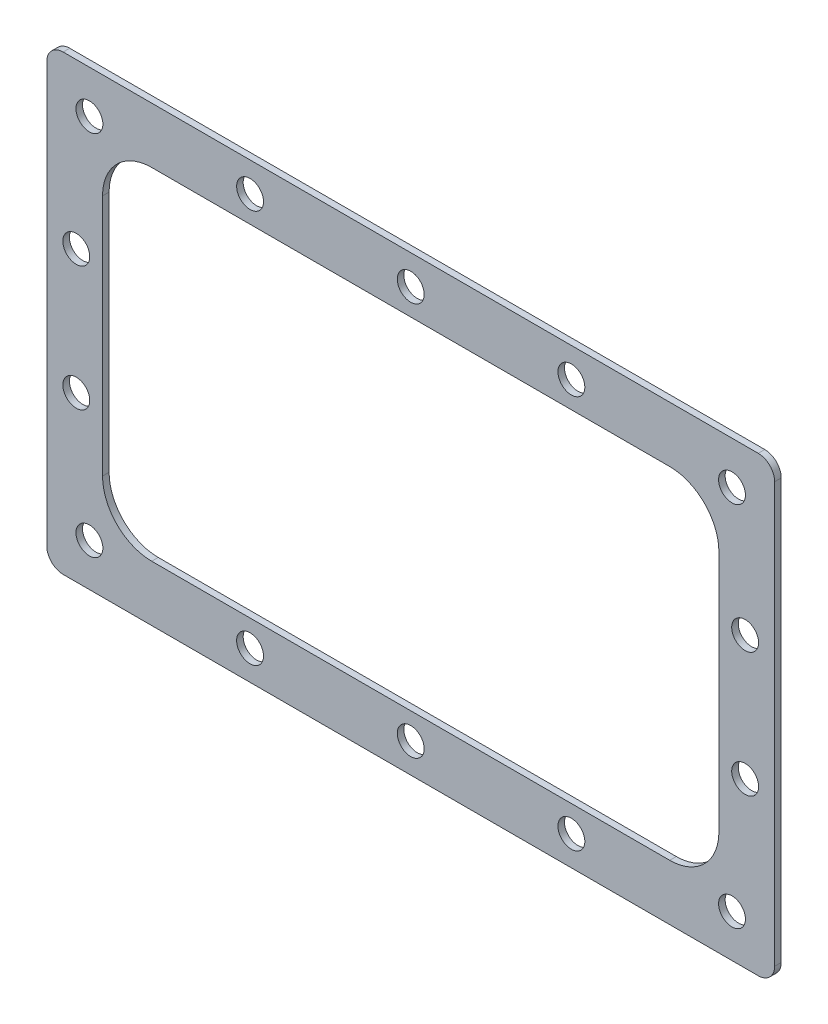
ISO-10303-21;
HEADER;
FILE_DESCRIPTION(('STEP AP214'),'2;1');
FILE_NAME('part.step','',(''),(''),'','','');
FILE_SCHEMA(('AUTOMOTIVE_DESIGN { 1 0 10303 214 1 1 1 1 }'));
ENDSEC;
DATA;
#1=APPLICATION_CONTEXT('core data for automotive mechanical design processes');
#2=APPLICATION_PROTOCOL_DEFINITION('international standard','automotive_design',2000,#1);
#3=PRODUCT_CONTEXT('',#1,'mechanical');
#4=PRODUCT('Part','Part','',(#3));
#5=PRODUCT_RELATED_PRODUCT_CATEGORY('part','',(#4));
#6=PRODUCT_DEFINITION_FORMATION('','',#4);
#7=PRODUCT_DEFINITION_CONTEXT('part definition',#1,'design');
#8=PRODUCT_DEFINITION('design','',#6,#7);
#9=PRODUCT_DEFINITION_SHAPE('','',#8);
#10=(LENGTH_UNIT() NAMED_UNIT(*) SI_UNIT(.MILLI.,.METRE.));
#11=(NAMED_UNIT(*) PLANE_ANGLE_UNIT() SI_UNIT($,.RADIAN.));
#12=(NAMED_UNIT(*) SI_UNIT($,.STERADIAN.) SOLID_ANGLE_UNIT());
#13=UNCERTAINTY_MEASURE_WITH_UNIT(LENGTH_MEASURE(1.E-05),#10,'distance_accuracy_value','');
#14=(GEOMETRIC_REPRESENTATION_CONTEXT(3) GLOBAL_UNCERTAINTY_ASSIGNED_CONTEXT((#13)) GLOBAL_UNIT_ASSIGNED_CONTEXT((#10,
#11,#12)) REPRESENTATION_CONTEXT('',''));
#15=CARTESIAN_POINT('',(0.,0.,0.));
#16=DIRECTION('',(0.,0.,1.));
#17=DIRECTION('',(1.,0.,0.));
#18=AXIS2_PLACEMENT_3D('',#15,#16,#17);
#19=CARTESIAN_POINT('',(0.,0.,1.));
#20=DIRECTION('',(0.,0.,1.));
#21=DIRECTION('',(1.,0.,0.));
#22=AXIS2_PLACEMENT_3D('',#19,#20,#21);
#23=PLANE('',#22);
#24=DIRECTION('',(-1.,0.,0.));
#25=VECTOR('',#24,1.);
#26=CARTESIAN_POINT('',(47.0000000000001,-26.0000000000001,1.));
#27=LINE('',#26,#25);
#28=CARTESIAN_POINT('',(39.5000000000001,-26.0000000000001,1.));
#29=VERTEX_POINT('',#28);
#30=CARTESIAN_POINT('',(-39.5,-26.,1.));
#31=VERTEX_POINT('',#30);
#32=EDGE_CURVE('E307',#29,#31,#27,.T.);
#33=ORIENTED_EDGE('',*,*,#32,.T.);
#34=CARTESIAN_POINT('',(-39.5,-18.5,1.));
#35=DIRECTION('',(0.,0.,1.));
#36=DIRECTION('',(1.,0.,0.));
#37=AXIS2_PLACEMENT_3D('',#34,#35,#36);
#38=CIRCLE('',#37,7.5);
#39=CARTESIAN_POINT('',(-47.,-18.5,1.));
#40=VERTEX_POINT('',#39);
#41=EDGE_CURVE('E350',#31,#40,#38,.F.);
#42=ORIENTED_EDGE('',*,*,#41,.T.);
#43=DIRECTION('',(0.,1.,0.));
#44=VECTOR('',#43,1.);
#45=CARTESIAN_POINT('',(-47.,26.,1.));
#46=LINE('',#45,#44);
#47=CARTESIAN_POINT('',(-47.,18.5,1.));
#48=VERTEX_POINT('',#47);
#49=EDGE_CURVE('E297',#40,#48,#46,.T.);
#50=ORIENTED_EDGE('',*,*,#49,.T.);
#51=CARTESIAN_POINT('',(-39.5,18.5,1.));
#52=DIRECTION('',(0.,0.,1.));
#53=DIRECTION('',(1.,0.,0.));
#54=AXIS2_PLACEMENT_3D('',#51,#52,#53);
#55=CIRCLE('',#54,7.5);
#56=CARTESIAN_POINT('',(-39.5,26.,1.));
#57=VERTEX_POINT('',#56);
#58=EDGE_CURVE('E11',#48,#57,#55,.F.);
#59=ORIENTED_EDGE('',*,*,#58,.T.);
#60=DIRECTION('',(1.,0.,0.));
#61=VECTOR('',#60,1.);
#62=CARTESIAN_POINT('',(47.0000000000001,26.,1.));
#63=LINE('',#62,#61);
#64=CARTESIAN_POINT('',(39.5000000000001,26.,1.));
#65=VERTEX_POINT('',#64);
#66=EDGE_CURVE('E300',#57,#65,#63,.T.);
#67=ORIENTED_EDGE('',*,*,#66,.T.);
#68=CARTESIAN_POINT('',(39.5000000000001,18.5,1.));
#69=DIRECTION('',(0.,0.,1.));
#70=DIRECTION('',(1.,0.,0.));
#71=AXIS2_PLACEMENT_3D('',#68,#69,#70);
#72=CIRCLE('',#71,7.5);
#73=CARTESIAN_POINT('',(47.0000000000001,18.5,1.));
#74=VERTEX_POINT('',#73);
#75=EDGE_CURVE('E346',#65,#74,#72,.F.);
#76=ORIENTED_EDGE('',*,*,#75,.T.);
#77=DIRECTION('',(0.,-1.,0.));
#78=VECTOR('',#77,1.);
#79=CARTESIAN_POINT('',(47.0000000000001,26.,1.));
#80=LINE('',#79,#78);
#81=CARTESIAN_POINT('',(47.0000000000001,-18.5000000000001,1.));
#82=VERTEX_POINT('',#81);
#83=EDGE_CURVE('E304',#74,#82,#80,.T.);
#84=ORIENTED_EDGE('',*,*,#83,.T.);
#85=CARTESIAN_POINT('',(39.5000000000001,-18.5000000000001,1.));
#86=DIRECTION('',(0.,0.,1.));
#87=DIRECTION('',(1.,0.,0.));
#88=AXIS2_PLACEMENT_3D('',#85,#86,#87);
#89=CIRCLE('',#88,7.5);
#90=EDGE_CURVE('E342',#82,#29,#89,.F.);
#91=ORIENTED_EDGE('',*,*,#90,.T.);
#92=EDGE_LOOP('',(#33,#42,#50,#59,#67,#76,#84,#91));
#93=FACE_BOUND('',#92,.T.);
#94=CARTESIAN_POINT('',(-49.,28.,1.));
#95=DIRECTION('',(0.,0.,1.));
#96=DIRECTION('',(1.,0.,0.));
#97=AXIS2_PLACEMENT_3D('',#94,#95,#96);
#98=CIRCLE('',#97,2.04999999999999);
#99=CARTESIAN_POINT('',(-46.95,28.,1.));
#100=VERTEX_POINT('',#99);
#101=EDGE_CURVE('E258',#100,#100,#98,.T.);
#102=ORIENTED_EDGE('',*,*,#101,.F.);
#103=EDGE_LOOP('',(#102));
#104=FACE_BOUND('',#103,.T.);
#105=CARTESIAN_POINT('',(-24.5,30.,1.));
#106=DIRECTION('',(0.,0.,1.));
#107=DIRECTION('',(1.,0.,0.));
#108=AXIS2_PLACEMENT_3D('',#105,#106,#107);
#109=CIRCLE('',#108,2.05);
#110=CARTESIAN_POINT('',(-22.45,30.,1.));
#111=VERTEX_POINT('',#110);
#112=EDGE_CURVE('E259',#111,#111,#109,.T.);
#113=ORIENTED_EDGE('',*,*,#112,.F.);
#114=EDGE_LOOP('',(#113));
#115=FACE_BOUND('',#114,.T.);
#116=CARTESIAN_POINT('',(0.,30.,1.));
#117=DIRECTION('',(0.,0.,1.));
#118=DIRECTION('',(1.,0.,0.));
#119=AXIS2_PLACEMENT_3D('',#116,#117,#118);
#120=CIRCLE('',#119,2.05);
#121=CARTESIAN_POINT('',(2.04999999999998,30.,1.));
#122=VERTEX_POINT('',#121);
#123=EDGE_CURVE('E265',#122,#122,#120,.T.);
#124=ORIENTED_EDGE('',*,*,#123,.F.);
#125=EDGE_LOOP('',(#124));
#126=FACE_BOUND('',#125,.T.);
#127=CARTESIAN_POINT('',(24.5,30.,1.));
#128=DIRECTION('',(0.,0.,1.));
#129=DIRECTION('',(1.,0.,0.));
#130=AXIS2_PLACEMENT_3D('',#127,#128,#129);
#131=CIRCLE('',#130,2.05);
#132=CARTESIAN_POINT('',(26.55,30.,1.));
#133=VERTEX_POINT('',#132);
#134=EDGE_CURVE('E271',#133,#133,#131,.T.);
#135=ORIENTED_EDGE('',*,*,#134,.F.);
#136=EDGE_LOOP('',(#135));
#137=FACE_BOUND('',#136,.T.);
#138=CARTESIAN_POINT('',(49.,28.,1.));
#139=DIRECTION('',(0.,0.,1.));
#140=DIRECTION('',(1.,0.,0.));
#141=AXIS2_PLACEMENT_3D('',#138,#139,#140);
#142=CIRCLE('',#141,2.04999999999999);
#143=CARTESIAN_POINT('',(51.05,28.,1.));
#144=VERTEX_POINT('',#143);
#145=EDGE_CURVE('E277',#144,#144,#142,.T.);
#146=ORIENTED_EDGE('',*,*,#145,.F.);
#147=EDGE_LOOP('',(#146));
#148=FACE_BOUND('',#147,.T.);
#149=CARTESIAN_POINT('',(51.,9.50000000000001,1.));
#150=DIRECTION('',(0.,0.,1.));
#151=DIRECTION('',(1.,0.,0.));
#152=AXIS2_PLACEMENT_3D('',#149,#150,#151);
#153=CIRCLE('',#152,2.04999999999999);
#154=CARTESIAN_POINT('',(53.05,9.50000000000001,1.));
#155=VERTEX_POINT('',#154);
#156=EDGE_CURVE('E283',#155,#155,#153,.T.);
#157=ORIENTED_EDGE('',*,*,#156,.F.);
#158=EDGE_LOOP('',(#157));
#159=FACE_BOUND('',#158,.T.);
#160=CARTESIAN_POINT('',(51.,-9.49999999999999,1.));
#161=DIRECTION('',(0.,0.,1.));
#162=DIRECTION('',(1.,0.,0.));
#163=AXIS2_PLACEMENT_3D('',#160,#161,#162);
#164=CIRCLE('',#163,2.04999999999999);
#165=CARTESIAN_POINT('',(53.05,-9.49999999999999,1.));
#166=VERTEX_POINT('',#165);
#167=EDGE_CURVE('E216',#166,#166,#164,.T.);
#168=ORIENTED_EDGE('',*,*,#167,.F.);
#169=EDGE_LOOP('',(#168));
#170=FACE_BOUND('',#169,.T.);
#171=CARTESIAN_POINT('',(49.,-28.,1.));
#172=DIRECTION('',(0.,0.,1.));
#173=DIRECTION('',(1.,0.,0.));
#174=AXIS2_PLACEMENT_3D('',#171,#172,#173);
#175=CIRCLE('',#174,2.04999999999999);
#176=CARTESIAN_POINT('',(51.05,-28.,1.));
#177=VERTEX_POINT('',#176);
#178=EDGE_CURVE('E217',#177,#177,#175,.T.);
#179=ORIENTED_EDGE('',*,*,#178,.F.);
#180=EDGE_LOOP('',(#179));
#181=FACE_BOUND('',#180,.T.);
#182=CARTESIAN_POINT('',(24.5,-30.,1.));
#183=DIRECTION('',(0.,0.,1.));
#184=DIRECTION('',(1.,0.,0.));
#185=AXIS2_PLACEMENT_3D('',#182,#183,#184);
#186=CIRCLE('',#185,2.05);
#187=CARTESIAN_POINT('',(26.55,-30.,1.));
#188=VERTEX_POINT('',#187);
#189=EDGE_CURVE('E223',#188,#188,#186,.T.);
#190=ORIENTED_EDGE('',*,*,#189,.F.);
#191=EDGE_LOOP('',(#190));
#192=FACE_BOUND('',#191,.T.);
#193=CARTESIAN_POINT('',(0.,-30.,1.));
#194=DIRECTION('',(0.,0.,1.));
#195=DIRECTION('',(1.,0.,0.));
#196=AXIS2_PLACEMENT_3D('',#193,#194,#195);
#197=CIRCLE('',#196,2.05);
#198=CARTESIAN_POINT('',(2.04999999999998,-30.,1.));
#199=VERTEX_POINT('',#198);
#200=EDGE_CURVE('E229',#199,#199,#197,.T.);
#201=ORIENTED_EDGE('',*,*,#200,.F.);
#202=EDGE_LOOP('',(#201));
#203=FACE_BOUND('',#202,.T.);
#204=CARTESIAN_POINT('',(-24.5,-30.,1.));
#205=DIRECTION('',(0.,0.,1.));
#206=DIRECTION('',(1.,0.,0.));
#207=AXIS2_PLACEMENT_3D('',#204,#205,#206);
#208=CIRCLE('',#207,2.05);
#209=CARTESIAN_POINT('',(-22.45,-30.,1.));
#210=VERTEX_POINT('',#209);
#211=EDGE_CURVE('E235',#210,#210,#208,.T.);
#212=ORIENTED_EDGE('',*,*,#211,.F.);
#213=EDGE_LOOP('',(#212));
#214=FACE_BOUND('',#213,.T.);
#215=CARTESIAN_POINT('',(-49.,-28.,1.));
#216=DIRECTION('',(0.,0.,1.));
#217=DIRECTION('',(1.,0.,0.));
#218=AXIS2_PLACEMENT_3D('',#215,#216,#217);
#219=CIRCLE('',#218,2.04999999999999);
#220=CARTESIAN_POINT('',(-46.95,-28.,1.));
#221=VERTEX_POINT('',#220);
#222=EDGE_CURVE('E241',#221,#221,#219,.T.);
#223=ORIENTED_EDGE('',*,*,#222,.F.);
#224=EDGE_LOOP('',(#223));
#225=FACE_BOUND('',#224,.T.);
#226=CARTESIAN_POINT('',(-51.,-9.49999999999999,1.));
#227=DIRECTION('',(0.,0.,1.));
#228=DIRECTION('',(1.,0.,0.));
#229=AXIS2_PLACEMENT_3D('',#226,#227,#228);
#230=CIRCLE('',#229,2.04999999999999);
#231=CARTESIAN_POINT('',(-48.95,-9.49999999999999,1.));
#232=VERTEX_POINT('',#231);
#233=EDGE_CURVE('E247',#232,#232,#230,.T.);
#234=ORIENTED_EDGE('',*,*,#233,.F.);
#235=EDGE_LOOP('',(#234));
#236=FACE_BOUND('',#235,.T.);
#237=CARTESIAN_POINT('',(-51.,9.50000000000001,1.));
#238=DIRECTION('',(0.,0.,1.));
#239=DIRECTION('',(1.,0.,0.));
#240=AXIS2_PLACEMENT_3D('',#237,#238,#239);
#241=CIRCLE('',#240,2.04999999999999);
#242=CARTESIAN_POINT('',(-48.95,9.50000000000001,1.));
#243=VERTEX_POINT('',#242);
#244=EDGE_CURVE('E203',#243,#243,#241,.T.);
#245=ORIENTED_EDGE('',*,*,#244,.F.);
#246=EDGE_LOOP('',(#245));
#247=FACE_BOUND('',#246,.T.);
#248=DIRECTION('',(0.,-1.,0.));
#249=VECTOR('',#248,1.);
#250=CARTESIAN_POINT('',(-55.5,32.,1.));
#251=LINE('',#250,#249);
#252=CARTESIAN_POINT('',(-55.5,32.,1.));
#253=VERTEX_POINT('',#252);
#254=CARTESIAN_POINT('',(-55.5,-32.,1.));
#255=VERTEX_POINT('',#254);
#256=EDGE_CURVE('E198',#253,#255,#251,.T.);
#257=ORIENTED_EDGE('',*,*,#256,.T.);
#258=CARTESIAN_POINT('',(-53.,-32.,1.));
#259=DIRECTION('',(0.,0.,1.));
#260=DIRECTION('',(1.,0.,0.));
#261=AXIS2_PLACEMENT_3D('',#258,#259,#260);
#262=CIRCLE('',#261,2.50000000000001);
#263=CARTESIAN_POINT('',(-53.,-34.5,1.));
#264=VERTEX_POINT('',#263);
#265=EDGE_CURVE('E181',#255,#264,#262,.T.);
#266=ORIENTED_EDGE('',*,*,#265,.T.);
#267=DIRECTION('',(1.,0.,0.));
#268=VECTOR('',#267,1.);
#269=CARTESIAN_POINT('',(-53.,-34.5,1.));
#270=LINE('',#269,#268);
#271=CARTESIAN_POINT('',(53.,-34.5,1.));
#272=VERTEX_POINT('',#271);
#273=EDGE_CURVE('E184',#264,#272,#270,.T.);
#274=ORIENTED_EDGE('',*,*,#273,.T.);
#275=CARTESIAN_POINT('',(53.,-32.,1.));
#276=DIRECTION('',(0.,0.,1.));
#277=DIRECTION('',(1.,0.,0.));
#278=AXIS2_PLACEMENT_3D('',#275,#276,#277);
#279=CIRCLE('',#278,2.5);
#280=CARTESIAN_POINT('',(55.5,-32.,1.));
#281=VERTEX_POINT('',#280);
#282=EDGE_CURVE('E47',#272,#281,#279,.T.);
#283=ORIENTED_EDGE('',*,*,#282,.T.);
#284=DIRECTION('',(0.,1.,0.));
#285=VECTOR('',#284,1.);
#286=CARTESIAN_POINT('',(55.5,32.,1.));
#287=LINE('',#286,#285);
#288=CARTESIAN_POINT('',(55.5,32.,1.));
#289=VERTEX_POINT('',#288);
#290=EDGE_CURVE('E151',#281,#289,#287,.T.);
#291=ORIENTED_EDGE('',*,*,#290,.T.);
#292=CARTESIAN_POINT('',(53.,32.,1.));
#293=DIRECTION('',(0.,0.,1.));
#294=DIRECTION('',(-1.,0.,0.));
#295=AXIS2_PLACEMENT_3D('',#292,#293,#294);
#296=CIRCLE('',#295,2.50000000000001);
#297=CARTESIAN_POINT('',(53.,34.5,1.));
#298=VERTEX_POINT('',#297);
#299=EDGE_CURVE('E189',#289,#298,#296,.T.);
#300=ORIENTED_EDGE('',*,*,#299,.T.);
#301=DIRECTION('',(-1.,0.,0.));
#302=VECTOR('',#301,1.);
#303=CARTESIAN_POINT('',(-53.,34.5,1.));
#304=LINE('',#303,#302);
#305=CARTESIAN_POINT('',(-53.,34.5,1.));
#306=VERTEX_POINT('',#305);
#307=EDGE_CURVE('E192',#298,#306,#304,.T.);
#308=ORIENTED_EDGE('',*,*,#307,.T.);
#309=CARTESIAN_POINT('',(-53.,32.,1.));
#310=DIRECTION('',(0.,0.,1.));
#311=DIRECTION('',(1.,0.,0.));
#312=AXIS2_PLACEMENT_3D('',#309,#310,#311);
#313=CIRCLE('',#312,2.50000000000001);
#314=EDGE_CURVE('E195',#306,#253,#313,.T.);
#315=ORIENTED_EDGE('',*,*,#314,.T.);
#316=EDGE_LOOP('',(#257,#266,#274,#283,#291,#300,#308,#315));
#317=FACE_BOUND('',#316,.T.);
#318=ADVANCED_FACE('F32',(#93,#104,#115,#126,#137,#148,#159,#170,#181,#192,#203,#214,#225,#236,
#247,#317),#23,.T.);
#319=CARTESIAN_POINT('',(0.,0.,0.));
#320=DIRECTION('',(0.,0.,1.));
#321=DIRECTION('',(1.,0.,0.));
#322=AXIS2_PLACEMENT_3D('',#319,#320,#321);
#323=PLANE('',#322);
#324=DIRECTION('',(1.,0.,0.));
#325=VECTOR('',#324,1.);
#326=CARTESIAN_POINT('',(47.0000000000001,26.,0.));
#327=LINE('',#326,#325);
#328=CARTESIAN_POINT('',(-39.5,26.,0.));
#329=VERTEX_POINT('',#328);
#330=CARTESIAN_POINT('',(39.5000000000001,26.,0.));
#331=VERTEX_POINT('',#330);
#332=EDGE_CURVE('E313',#329,#331,#327,.T.);
#333=ORIENTED_EDGE('',*,*,#332,.F.);
#334=CARTESIAN_POINT('',(-39.5,18.5,0.));
#335=DIRECTION('',(0.,0.,1.));
#336=DIRECTION('',(1.,0.,0.));
#337=AXIS2_PLACEMENT_3D('',#334,#335,#336);
#338=CIRCLE('',#337,7.5);
#339=CARTESIAN_POINT('',(-47.,18.5,0.));
#340=VERTEX_POINT('',#339);
#341=EDGE_CURVE('E40',#329,#340,#338,.T.);
#342=ORIENTED_EDGE('',*,*,#341,.T.);
#343=DIRECTION('',(0.,1.,0.));
#344=VECTOR('',#343,1.);
#345=CARTESIAN_POINT('',(-47.,26.,0.));
#346=LINE('',#345,#344);
#347=CARTESIAN_POINT('',(-47.,-18.5,0.));
#348=VERTEX_POINT('',#347);
#349=EDGE_CURVE('E294',#348,#340,#346,.T.);
#350=ORIENTED_EDGE('',*,*,#349,.F.);
#351=CARTESIAN_POINT('',(-39.5,-18.5,0.));
#352=DIRECTION('',(0.,0.,1.));
#353=DIRECTION('',(1.,0.,0.));
#354=AXIS2_PLACEMENT_3D('',#351,#352,#353);
#355=CIRCLE('',#354,7.5);
#356=CARTESIAN_POINT('',(-39.5,-26.,0.));
#357=VERTEX_POINT('',#356);
#358=EDGE_CURVE('E348',#348,#357,#355,.T.);
#359=ORIENTED_EDGE('',*,*,#358,.T.);
#360=DIRECTION('',(-1.,0.,0.));
#361=VECTOR('',#360,1.);
#362=CARTESIAN_POINT('',(47.0000000000001,-26.0000000000001,0.));
#363=LINE('',#362,#361);
#364=CARTESIAN_POINT('',(39.5000000000001,-26.0000000000001,0.));
#365=VERTEX_POINT('',#364);
#366=EDGE_CURVE('E301',#365,#357,#363,.T.);
#367=ORIENTED_EDGE('',*,*,#366,.F.);
#368=CARTESIAN_POINT('',(39.5000000000001,-18.5000000000001,0.));
#369=DIRECTION('',(0.,0.,1.));
#370=DIRECTION('',(1.,0.,0.));
#371=AXIS2_PLACEMENT_3D('',#368,#369,#370);
#372=CIRCLE('',#371,7.5);
#373=CARTESIAN_POINT('',(47.0000000000001,-18.5000000000001,0.));
#374=VERTEX_POINT('',#373);
#375=EDGE_CURVE('E340',#365,#374,#372,.T.);
#376=ORIENTED_EDGE('',*,*,#375,.T.);
#377=DIRECTION('',(0.,-1.,0.));
#378=VECTOR('',#377,1.);
#379=CARTESIAN_POINT('',(47.0000000000001,26.,0.));
#380=LINE('',#379,#378);
#381=CARTESIAN_POINT('',(47.0000000000001,18.5,0.));
#382=VERTEX_POINT('',#381);
#383=EDGE_CURVE('E316',#382,#374,#380,.T.);
#384=ORIENTED_EDGE('',*,*,#383,.F.);
#385=CARTESIAN_POINT('',(39.5000000000001,18.5,0.));
#386=DIRECTION('',(0.,0.,1.));
#387=DIRECTION('',(1.,0.,0.));
#388=AXIS2_PLACEMENT_3D('',#385,#386,#387);
#389=CIRCLE('',#388,7.5);
#390=EDGE_CURVE('E344',#382,#331,#389,.T.);
#391=ORIENTED_EDGE('',*,*,#390,.T.);
#392=EDGE_LOOP('',(#333,#342,#350,#359,#367,#376,#384,#391));
#393=FACE_BOUND('',#392,.T.);
#394=CARTESIAN_POINT('',(-49.,28.,0.));
#395=DIRECTION('',(0.,0.,1.));
#396=DIRECTION('',(1.,0.,0.));
#397=AXIS2_PLACEMENT_3D('',#394,#395,#396);
#398=CIRCLE('',#397,2.04999999999999);
#399=CARTESIAN_POINT('',(-46.95,28.,0.));
#400=VERTEX_POINT('',#399);
#401=EDGE_CURVE('E291',#400,#400,#398,.T.);
#402=ORIENTED_EDGE('',*,*,#401,.T.);
#403=EDGE_LOOP('',(#402));
#404=FACE_BOUND('',#403,.T.);
#405=CARTESIAN_POINT('',(-24.5,30.,0.));
#406=DIRECTION('',(0.,0.,1.));
#407=DIRECTION('',(1.,0.,0.));
#408=AXIS2_PLACEMENT_3D('',#405,#406,#407);
#409=CIRCLE('',#408,2.05);
#410=CARTESIAN_POINT('',(-22.45,30.,0.));
#411=VERTEX_POINT('',#410);
#412=EDGE_CURVE('E255',#411,#411,#409,.T.);
#413=ORIENTED_EDGE('',*,*,#412,.T.);
#414=EDGE_LOOP('',(#413));
#415=FACE_BOUND('',#414,.T.);
#416=CARTESIAN_POINT('',(0.,30.,0.));
#417=DIRECTION('',(0.,0.,1.));
#418=DIRECTION('',(1.,0.,0.));
#419=AXIS2_PLACEMENT_3D('',#416,#417,#418);
#420=CIRCLE('',#419,2.05);
#421=CARTESIAN_POINT('',(2.04999999999998,30.,0.));
#422=VERTEX_POINT('',#421);
#423=EDGE_CURVE('E262',#422,#422,#420,.T.);
#424=ORIENTED_EDGE('',*,*,#423,.T.);
#425=EDGE_LOOP('',(#424));
#426=FACE_BOUND('',#425,.T.);
#427=CARTESIAN_POINT('',(24.5,30.,0.));
#428=DIRECTION('',(0.,0.,1.));
#429=DIRECTION('',(1.,0.,0.));
#430=AXIS2_PLACEMENT_3D('',#427,#428,#429);
#431=CIRCLE('',#430,2.05);
#432=CARTESIAN_POINT('',(26.55,30.,0.));
#433=VERTEX_POINT('',#432);
#434=EDGE_CURVE('E268',#433,#433,#431,.T.);
#435=ORIENTED_EDGE('',*,*,#434,.T.);
#436=EDGE_LOOP('',(#435));
#437=FACE_BOUND('',#436,.T.);
#438=CARTESIAN_POINT('',(49.,28.,0.));
#439=DIRECTION('',(0.,0.,1.));
#440=DIRECTION('',(1.,0.,0.));
#441=AXIS2_PLACEMENT_3D('',#438,#439,#440);
#442=CIRCLE('',#441,2.04999999999999);
#443=CARTESIAN_POINT('',(51.05,28.,0.));
#444=VERTEX_POINT('',#443);
#445=EDGE_CURVE('E274',#444,#444,#442,.T.);
#446=ORIENTED_EDGE('',*,*,#445,.T.);
#447=EDGE_LOOP('',(#446));
#448=FACE_BOUND('',#447,.T.);
#449=CARTESIAN_POINT('',(51.,9.50000000000001,0.));
#450=DIRECTION('',(0.,0.,1.));
#451=DIRECTION('',(1.,0.,0.));
#452=AXIS2_PLACEMENT_3D('',#449,#450,#451);
#453=CIRCLE('',#452,2.04999999999999);
#454=CARTESIAN_POINT('',(53.05,9.50000000000001,0.));
#455=VERTEX_POINT('',#454);
#456=EDGE_CURVE('E280',#455,#455,#453,.T.);
#457=ORIENTED_EDGE('',*,*,#456,.T.);
#458=EDGE_LOOP('',(#457));
#459=FACE_BOUND('',#458,.T.);
#460=CARTESIAN_POINT('',(51.,-9.49999999999999,0.));
#461=DIRECTION('',(0.,0.,1.));
#462=DIRECTION('',(1.,0.,0.));
#463=AXIS2_PLACEMENT_3D('',#460,#461,#462);
#464=CIRCLE('',#463,2.04999999999999);
#465=CARTESIAN_POINT('',(53.05,-9.49999999999999,0.));
#466=VERTEX_POINT('',#465);
#467=EDGE_CURVE('E286',#466,#466,#464,.T.);
#468=ORIENTED_EDGE('',*,*,#467,.T.);
#469=EDGE_LOOP('',(#468));
#470=FACE_BOUND('',#469,.T.);
#471=CARTESIAN_POINT('',(49.,-28.,0.));
#472=DIRECTION('',(0.,0.,1.));
#473=DIRECTION('',(1.,0.,0.));
#474=AXIS2_PLACEMENT_3D('',#471,#472,#473);
#475=CIRCLE('',#474,2.04999999999999);
#476=CARTESIAN_POINT('',(51.05,-28.,0.));
#477=VERTEX_POINT('',#476);
#478=EDGE_CURVE('E213',#477,#477,#475,.T.);
#479=ORIENTED_EDGE('',*,*,#478,.T.);
#480=EDGE_LOOP('',(#479));
#481=FACE_BOUND('',#480,.T.);
#482=CARTESIAN_POINT('',(24.5,-30.,0.));
#483=DIRECTION('',(0.,0.,1.));
#484=DIRECTION('',(1.,0.,0.));
#485=AXIS2_PLACEMENT_3D('',#482,#483,#484);
#486=CIRCLE('',#485,2.05);
#487=CARTESIAN_POINT('',(26.55,-30.,0.));
#488=VERTEX_POINT('',#487);
#489=EDGE_CURVE('E220',#488,#488,#486,.T.);
#490=ORIENTED_EDGE('',*,*,#489,.T.);
#491=EDGE_LOOP('',(#490));
#492=FACE_BOUND('',#491,.T.);
#493=CARTESIAN_POINT('',(0.,-30.,0.));
#494=DIRECTION('',(0.,0.,1.));
#495=DIRECTION('',(1.,0.,0.));
#496=AXIS2_PLACEMENT_3D('',#493,#494,#495);
#497=CIRCLE('',#496,2.05);
#498=CARTESIAN_POINT('',(2.04999999999998,-30.,0.));
#499=VERTEX_POINT('',#498);
#500=EDGE_CURVE('E226',#499,#499,#497,.T.);
#501=ORIENTED_EDGE('',*,*,#500,.T.);
#502=EDGE_LOOP('',(#501));
#503=FACE_BOUND('',#502,.T.);
#504=CARTESIAN_POINT('',(-24.5,-30.,0.));
#505=DIRECTION('',(0.,0.,1.));
#506=DIRECTION('',(1.,0.,0.));
#507=AXIS2_PLACEMENT_3D('',#504,#505,#506);
#508=CIRCLE('',#507,2.05);
#509=CARTESIAN_POINT('',(-22.45,-30.,0.));
#510=VERTEX_POINT('',#509);
#511=EDGE_CURVE('E232',#510,#510,#508,.T.);
#512=ORIENTED_EDGE('',*,*,#511,.T.);
#513=EDGE_LOOP('',(#512));
#514=FACE_BOUND('',#513,.T.);
#515=CARTESIAN_POINT('',(-49.,-28.,0.));
#516=DIRECTION('',(0.,0.,1.));
#517=DIRECTION('',(1.,0.,0.));
#518=AXIS2_PLACEMENT_3D('',#515,#516,#517);
#519=CIRCLE('',#518,2.04999999999999);
#520=CARTESIAN_POINT('',(-46.95,-28.,0.));
#521=VERTEX_POINT('',#520);
#522=EDGE_CURVE('E238',#521,#521,#519,.T.);
#523=ORIENTED_EDGE('',*,*,#522,.T.);
#524=EDGE_LOOP('',(#523));
#525=FACE_BOUND('',#524,.T.);
#526=CARTESIAN_POINT('',(-51.,-9.49999999999999,0.));
#527=DIRECTION('',(0.,0.,1.));
#528=DIRECTION('',(1.,0.,0.));
#529=AXIS2_PLACEMENT_3D('',#526,#527,#528);
#530=CIRCLE('',#529,2.04999999999999);
#531=CARTESIAN_POINT('',(-48.95,-9.49999999999999,0.));
#532=VERTEX_POINT('',#531);
#533=EDGE_CURVE('E244',#532,#532,#530,.T.);
#534=ORIENTED_EDGE('',*,*,#533,.T.);
#535=EDGE_LOOP('',(#534));
#536=FACE_BOUND('',#535,.T.);
#537=CARTESIAN_POINT('',(-51.,9.50000000000001,0.));
#538=DIRECTION('',(0.,0.,1.));
#539=DIRECTION('',(1.,0.,0.));
#540=AXIS2_PLACEMENT_3D('',#537,#538,#539);
#541=CIRCLE('',#540,2.04999999999999);
#542=CARTESIAN_POINT('',(-48.95,9.50000000000001,0.));
#543=VERTEX_POINT('',#542);
#544=EDGE_CURVE('E250',#543,#543,#541,.T.);
#545=ORIENTED_EDGE('',*,*,#544,.T.);
#546=EDGE_LOOP('',(#545));
#547=FACE_BOUND('',#546,.T.);
#548=CARTESIAN_POINT('',(-53.,-32.,0.));
#549=DIRECTION('',(0.,0.,1.));
#550=DIRECTION('',(1.,0.,0.));
#551=AXIS2_PLACEMENT_3D('',#548,#549,#550);
#552=CIRCLE('',#551,2.50000000000001);
#553=CARTESIAN_POINT('',(-55.5,-32.,0.));
#554=VERTEX_POINT('',#553);
#555=CARTESIAN_POINT('',(-53.,-34.5,0.));
#556=VERTEX_POINT('',#555);
#557=EDGE_CURVE('E55',#554,#556,#552,.T.);
#558=ORIENTED_EDGE('',*,*,#557,.F.);
#559=DIRECTION('',(0.,-1.,0.));
#560=VECTOR('',#559,1.);
#561=CARTESIAN_POINT('',(-55.5,32.,0.));
#562=LINE('',#561,#560);
#563=CARTESIAN_POINT('',(-55.5,32.,0.));
#564=VERTEX_POINT('',#563);
#565=EDGE_CURVE('E177',#564,#554,#562,.T.);
#566=ORIENTED_EDGE('',*,*,#565,.F.);
#567=CARTESIAN_POINT('',(-53.,32.,0.));
#568=DIRECTION('',(0.,0.,1.));
#569=DIRECTION('',(1.,0.,0.));
#570=AXIS2_PLACEMENT_3D('',#567,#568,#569);
#571=CIRCLE('',#570,2.50000000000001);
#572=CARTESIAN_POINT('',(-53.,34.5,0.));
#573=VERTEX_POINT('',#572);
#574=EDGE_CURVE('E174',#573,#564,#571,.T.);
#575=ORIENTED_EDGE('',*,*,#574,.F.);
#576=DIRECTION('',(-1.,0.,0.));
#577=VECTOR('',#576,1.);
#578=CARTESIAN_POINT('',(-53.,34.5,0.));
#579=LINE('',#578,#577);
#580=CARTESIAN_POINT('',(53.,34.5,0.));
#581=VERTEX_POINT('',#580);
#582=EDGE_CURVE('E168',#581,#573,#579,.T.);
#583=ORIENTED_EDGE('',*,*,#582,.F.);
#584=CARTESIAN_POINT('',(53.,32.,0.));
#585=DIRECTION('',(0.,0.,1.));
#586=DIRECTION('',(-1.,0.,0.));
#587=AXIS2_PLACEMENT_3D('',#584,#585,#586);
#588=CIRCLE('',#587,2.50000000000001);
#589=CARTESIAN_POINT('',(55.5,32.,0.));
#590=VERTEX_POINT('',#589);
#591=EDGE_CURVE('E166',#590,#581,#588,.T.);
#592=ORIENTED_EDGE('',*,*,#591,.F.);
#593=DIRECTION('',(0.,1.,0.));
#594=VECTOR('',#593,1.);
#595=CARTESIAN_POINT('',(55.5,32.,0.));
#596=LINE('',#595,#594);
#597=CARTESIAN_POINT('',(55.5,-32.,0.));
#598=VERTEX_POINT('',#597);
#599=EDGE_CURVE('E148',#598,#590,#596,.T.);
#600=ORIENTED_EDGE('',*,*,#599,.F.);
#601=CARTESIAN_POINT('',(53.,-32.,0.));
#602=DIRECTION('',(0.,0.,1.));
#603=DIRECTION('',(1.,0.,0.));
#604=AXIS2_PLACEMENT_3D('',#601,#602,#603);
#605=CIRCLE('',#604,2.5);
#606=CARTESIAN_POINT('',(53.,-34.5,0.));
#607=VERTEX_POINT('',#606);
#608=EDGE_CURVE('E156',#607,#598,#605,.T.);
#609=ORIENTED_EDGE('',*,*,#608,.F.);
#610=DIRECTION('',(1.,0.,0.));
#611=VECTOR('',#610,1.);
#612=CARTESIAN_POINT('',(-53.,-34.5,0.));
#613=LINE('',#612,#611);
#614=EDGE_CURVE('E161',#556,#607,#613,.T.);
#615=ORIENTED_EDGE('',*,*,#614,.F.);
#616=EDGE_LOOP('',(#558,#566,#575,#583,#592,#600,#609,#615));
#617=FACE_BOUND('',#616,.T.);
#618=ADVANCED_FACE('F163',(#393,#404,#415,#426,#437,#448,#459,#470,#481,#492,#503,#514,#525,
#536,#547,#617),#323,.F.);
#619=CARTESIAN_POINT('',(-47.,26.,1.));
#620=DIRECTION('',(-1.,0.,0.));
#621=DIRECTION('',(0.,-1.,0.));
#622=AXIS2_PLACEMENT_3D('',#619,#620,#621);
#623=PLANE('',#622);
#624=ORIENTED_EDGE('',*,*,#49,.F.);
#625=DIRECTION('',(0.,0.,-1.));
#626=VECTOR('',#625,1.);
#627=CARTESIAN_POINT('',(-47.,-18.5,0.));
#628=LINE('',#627,#626);
#629=EDGE_CURVE('E337',#40,#348,#628,.T.);
#630=ORIENTED_EDGE('',*,*,#629,.T.);
#631=ORIENTED_EDGE('',*,*,#349,.T.);
#632=DIRECTION('',(0.,0.,-1.));
#633=VECTOR('',#632,1.);
#634=CARTESIAN_POINT('',(-47.,18.5,1.));
#635=LINE('',#634,#633);
#636=EDGE_CURVE('E335',#340,#48,#635,.F.);
#637=ORIENTED_EDGE('',*,*,#636,.T.);
#638=EDGE_LOOP('',(#624,#630,#631,#637));
#639=FACE_BOUND('',#638,.T.);
#640=ADVANCED_FACE('F360',(#639),#623,.F.);
#641=CARTESIAN_POINT('',(47.0000000000001,-26.0000000000001,1.));
#642=DIRECTION('',(0.,-1.,0.));
#643=DIRECTION('',(1.,0.,0.));
#644=AXIS2_PLACEMENT_3D('',#641,#642,#643);
#645=PLANE('',#644);
#646=ORIENTED_EDGE('',*,*,#32,.F.);
#647=DIRECTION('',(0.,0.,-1.));
#648=VECTOR('',#647,1.);
#649=CARTESIAN_POINT('',(39.5000000000001,-26.0000000000001,0.));
#650=LINE('',#649,#648);
#651=EDGE_CURVE('E322',#29,#365,#650,.T.);
#652=ORIENTED_EDGE('',*,*,#651,.T.);
#653=ORIENTED_EDGE('',*,*,#366,.T.);
#654=DIRECTION('',(0.,0.,-1.));
#655=VECTOR('',#654,1.);
#656=CARTESIAN_POINT('',(-39.5,-26.,1.));
#657=LINE('',#656,#655);
#658=EDGE_CURVE('E310',#357,#31,#657,.F.);
#659=ORIENTED_EDGE('',*,*,#658,.T.);
#660=EDGE_LOOP('',(#646,#652,#653,#659));
#661=FACE_BOUND('',#660,.T.);
#662=ADVANCED_FACE('F385',(#661),#645,.F.);
#663=CARTESIAN_POINT('',(47.0000000000001,26.,1.));
#664=DIRECTION('',(1.,0.,0.));
#665=DIRECTION('',(0.,1.,0.));
#666=AXIS2_PLACEMENT_3D('',#663,#664,#665);
#667=PLANE('',#666);
#668=ORIENTED_EDGE('',*,*,#383,.T.);
#669=DIRECTION('',(0.,0.,-1.));
#670=VECTOR('',#669,1.);
#671=CARTESIAN_POINT('',(47.0000000000001,-18.5000000000001,1.));
#672=LINE('',#671,#670);
#673=EDGE_CURVE('E328',#374,#82,#672,.F.);
#674=ORIENTED_EDGE('',*,*,#673,.T.);
#675=ORIENTED_EDGE('',*,*,#83,.F.);
#676=DIRECTION('',(0.,0.,-1.));
#677=VECTOR('',#676,1.);
#678=CARTESIAN_POINT('',(47.0000000000001,18.5,0.));
#679=LINE('',#678,#677);
#680=EDGE_CURVE('E325',#74,#382,#679,.T.);
#681=ORIENTED_EDGE('',*,*,#680,.T.);
#682=EDGE_LOOP('',(#668,#674,#675,#681));
#683=FACE_BOUND('',#682,.T.);
#684=ADVANCED_FACE('F376',(#683),#667,.F.);
#685=CARTESIAN_POINT('',(47.0000000000001,26.,1.));
#686=DIRECTION('',(0.,1.,0.));
#687=DIRECTION('',(0.,0.,1.));
#688=AXIS2_PLACEMENT_3D('',#685,#686,#687);
#689=PLANE('',#688);
#690=ORIENTED_EDGE('',*,*,#332,.T.);
#691=DIRECTION('',(0.,0.,-1.));
#692=VECTOR('',#691,1.);
#693=CARTESIAN_POINT('',(39.5000000000001,26.,1.));
#694=LINE('',#693,#692);
#695=EDGE_CURVE('E333',#331,#65,#694,.F.);
#696=ORIENTED_EDGE('',*,*,#695,.T.);
#697=ORIENTED_EDGE('',*,*,#66,.F.);
#698=DIRECTION('',(0.,0.,-1.));
#699=VECTOR('',#698,1.);
#700=CARTESIAN_POINT('',(-39.5,26.,0.));
#701=LINE('',#700,#699);
#702=EDGE_CURVE('E330',#57,#329,#701,.T.);
#703=ORIENTED_EDGE('',*,*,#702,.T.);
#704=EDGE_LOOP('',(#690,#696,#697,#703));
#705=FACE_BOUND('',#704,.T.);
#706=ADVANCED_FACE('F368',(#705),#689,.F.);
#707=CARTESIAN_POINT('',(39.5000000000001,-18.5000000000001,1.));
#708=DIRECTION('',(0.,0.,1.));
#709=DIRECTION('',(1.,0.,0.));
#710=AXIS2_PLACEMENT_3D('',#707,#708,#709);
#711=CYLINDRICAL_SURFACE('',#710,7.5);
#712=ORIENTED_EDGE('',*,*,#90,.F.);
#713=ORIENTED_EDGE('',*,*,#673,.F.);
#714=ORIENTED_EDGE('',*,*,#375,.F.);
#715=ORIENTED_EDGE('',*,*,#651,.F.);
#716=EDGE_LOOP('',(#712,#713,#714,#715));
#717=FACE_BOUND('',#716,.T.);
#718=ADVANCED_FACE('F380',(#717),#711,.F.);
#719=CARTESIAN_POINT('',(39.5000000000001,18.5,1.));
#720=DIRECTION('',(0.,0.,1.));
#721=DIRECTION('',(1.,0.,0.));
#722=AXIS2_PLACEMENT_3D('',#719,#720,#721);
#723=CYLINDRICAL_SURFACE('',#722,7.5);
#724=ORIENTED_EDGE('',*,*,#75,.F.);
#725=ORIENTED_EDGE('',*,*,#695,.F.);
#726=ORIENTED_EDGE('',*,*,#390,.F.);
#727=ORIENTED_EDGE('',*,*,#680,.F.);
#728=EDGE_LOOP('',(#724,#725,#726,#727));
#729=FACE_BOUND('',#728,.T.);
#730=ADVANCED_FACE('F371',(#729),#723,.F.);
#731=CARTESIAN_POINT('',(-39.5,-18.5,1.));
#732=DIRECTION('',(0.,0.,1.));
#733=DIRECTION('',(1.,0.,0.));
#734=AXIS2_PLACEMENT_3D('',#731,#732,#733);
#735=CYLINDRICAL_SURFACE('',#734,7.5);
#736=ORIENTED_EDGE('',*,*,#41,.F.);
#737=ORIENTED_EDGE('',*,*,#658,.F.);
#738=ORIENTED_EDGE('',*,*,#358,.F.);
#739=ORIENTED_EDGE('',*,*,#629,.F.);
#740=EDGE_LOOP('',(#736,#737,#738,#739));
#741=FACE_BOUND('',#740,.T.);
#742=ADVANCED_FACE('F389',(#741),#735,.F.);
#743=CARTESIAN_POINT('',(-39.5,18.5,1.));
#744=DIRECTION('',(0.,0.,1.));
#745=DIRECTION('',(1.,0.,0.));
#746=AXIS2_PLACEMENT_3D('',#743,#744,#745);
#747=CYLINDRICAL_SURFACE('',#746,7.5);
#748=ORIENTED_EDGE('',*,*,#58,.F.);
#749=ORIENTED_EDGE('',*,*,#636,.F.);
#750=ORIENTED_EDGE('',*,*,#341,.F.);
#751=ORIENTED_EDGE('',*,*,#702,.F.);
#752=EDGE_LOOP('',(#748,#749,#750,#751));
#753=FACE_BOUND('',#752,.T.);
#754=ADVANCED_FACE('F34',(#753),#747,.F.);
#755=CARTESIAN_POINT('',(-49.,28.,0.));
#756=DIRECTION('',(0.,0.,1.));
#757=DIRECTION('',(1.,0.,0.));
#758=AXIS2_PLACEMENT_3D('',#755,#756,#757);
#759=CYLINDRICAL_SURFACE('',#758,2.04999999999999);
#760=ORIENTED_EDGE('',*,*,#401,.F.);
#761=EDGE_LOOP('',(#760));
#762=FACE_BOUND('',#761,.T.);
#763=ORIENTED_EDGE('',*,*,#101,.T.);
#764=EDGE_LOOP('',(#763));
#765=FACE_BOUND('',#764,.T.);
#766=ADVANCED_FACE('F395',(#762,#765),#759,.F.);
#767=CARTESIAN_POINT('',(-24.5,30.,0.));
#768=DIRECTION('',(0.,0.,1.));
#769=DIRECTION('',(1.,0.,0.));
#770=AXIS2_PLACEMENT_3D('',#767,#768,#769);
#771=CYLINDRICAL_SURFACE('',#770,2.05);
#772=ORIENTED_EDGE('',*,*,#412,.F.);
#773=EDGE_LOOP('',(#772));
#774=FACE_BOUND('',#773,.T.);
#775=ORIENTED_EDGE('',*,*,#112,.T.);
#776=EDGE_LOOP('',(#775));
#777=FACE_BOUND('',#776,.T.);
#778=ADVANCED_FACE('F419',(#774,#777),#771,.F.);
#779=CARTESIAN_POINT('',(0.,30.,0.));
#780=DIRECTION('',(0.,0.,1.));
#781=DIRECTION('',(1.,0.,0.));
#782=AXIS2_PLACEMENT_3D('',#779,#780,#781);
#783=CYLINDRICAL_SURFACE('',#782,2.05);
#784=ORIENTED_EDGE('',*,*,#423,.F.);
#785=EDGE_LOOP('',(#784));
#786=FACE_BOUND('',#785,.T.);
#787=ORIENTED_EDGE('',*,*,#123,.T.);
#788=EDGE_LOOP('',(#787));
#789=FACE_BOUND('',#788,.T.);
#790=ADVANCED_FACE('F437',(#786,#789),#783,.F.);
#791=CARTESIAN_POINT('',(24.5,30.,0.));
#792=DIRECTION('',(0.,0.,1.));
#793=DIRECTION('',(1.,0.,0.));
#794=AXIS2_PLACEMENT_3D('',#791,#792,#793);
#795=CYLINDRICAL_SURFACE('',#794,2.05);
#796=ORIENTED_EDGE('',*,*,#434,.F.);
#797=EDGE_LOOP('',(#796));
#798=FACE_BOUND('',#797,.T.);
#799=ORIENTED_EDGE('',*,*,#134,.T.);
#800=EDGE_LOOP('',(#799));
#801=FACE_BOUND('',#800,.T.);
#802=ADVANCED_FACE('F433',(#798,#801),#795,.F.);
#803=CARTESIAN_POINT('',(49.,28.,0.));
#804=DIRECTION('',(0.,0.,1.));
#805=DIRECTION('',(1.,0.,0.));
#806=AXIS2_PLACEMENT_3D('',#803,#804,#805);
#807=CYLINDRICAL_SURFACE('',#806,2.04999999999999);
#808=ORIENTED_EDGE('',*,*,#445,.F.);
#809=EDGE_LOOP('',(#808));
#810=FACE_BOUND('',#809,.T.);
#811=ORIENTED_EDGE('',*,*,#145,.T.);
#812=EDGE_LOOP('',(#811));
#813=FACE_BOUND('',#812,.T.);
#814=ADVANCED_FACE('F429',(#810,#813),#807,.F.);
#815=CARTESIAN_POINT('',(51.,9.50000000000001,0.));
#816=DIRECTION('',(0.,0.,1.));
#817=DIRECTION('',(1.,0.,0.));
#818=AXIS2_PLACEMENT_3D('',#815,#816,#817);
#819=CYLINDRICAL_SURFACE('',#818,2.04999999999999);
#820=ORIENTED_EDGE('',*,*,#456,.F.);
#821=EDGE_LOOP('',(#820));
#822=FACE_BOUND('',#821,.T.);
#823=ORIENTED_EDGE('',*,*,#156,.T.);
#824=EDGE_LOOP('',(#823));
#825=FACE_BOUND('',#824,.T.);
#826=ADVANCED_FACE('F425',(#822,#825),#819,.F.);
#827=CARTESIAN_POINT('',(51.,-9.49999999999999,0.));
#828=DIRECTION('',(0.,0.,1.));
#829=DIRECTION('',(1.,0.,0.));
#830=AXIS2_PLACEMENT_3D('',#827,#828,#829);
#831=CYLINDRICAL_SURFACE('',#830,2.04999999999999);
#832=ORIENTED_EDGE('',*,*,#467,.F.);
#833=EDGE_LOOP('',(#832));
#834=FACE_BOUND('',#833,.T.);
#835=ORIENTED_EDGE('',*,*,#167,.T.);
#836=EDGE_LOOP('',(#835));
#837=FACE_BOUND('',#836,.T.);
#838=ADVANCED_FACE('F421',(#834,#837),#831,.F.);
#839=CARTESIAN_POINT('',(49.,-28.,0.));
#840=DIRECTION('',(0.,0.,1.));
#841=DIRECTION('',(1.,0.,0.));
#842=AXIS2_PLACEMENT_3D('',#839,#840,#841);
#843=CYLINDRICAL_SURFACE('',#842,2.04999999999999);
#844=ORIENTED_EDGE('',*,*,#478,.F.);
#845=EDGE_LOOP('',(#844));
#846=FACE_BOUND('',#845,.T.);
#847=ORIENTED_EDGE('',*,*,#178,.T.);
#848=EDGE_LOOP('',(#847));
#849=FACE_BOUND('',#848,.T.);
#850=ADVANCED_FACE('F424',(#846,#849),#843,.F.);
#851=CARTESIAN_POINT('',(24.5,-30.,0.));
#852=DIRECTION('',(0.,0.,1.));
#853=DIRECTION('',(1.,0.,0.));
#854=AXIS2_PLACEMENT_3D('',#851,#852,#853);
#855=CYLINDRICAL_SURFACE('',#854,2.05);
#856=ORIENTED_EDGE('',*,*,#489,.F.);
#857=EDGE_LOOP('',(#856));
#858=FACE_BOUND('',#857,.T.);
#859=ORIENTED_EDGE('',*,*,#189,.T.);
#860=EDGE_LOOP('',(#859));
#861=FACE_BOUND('',#860,.T.);
#862=ADVANCED_FACE('F465',(#858,#861),#855,.F.);
#863=CARTESIAN_POINT('',(0.,-30.,0.));
#864=DIRECTION('',(0.,0.,1.));
#865=DIRECTION('',(1.,0.,0.));
#866=AXIS2_PLACEMENT_3D('',#863,#864,#865);
#867=CYLINDRICAL_SURFACE('',#866,2.05);
#868=ORIENTED_EDGE('',*,*,#500,.F.);
#869=EDGE_LOOP('',(#868));
#870=FACE_BOUND('',#869,.T.);
#871=ORIENTED_EDGE('',*,*,#200,.T.);
#872=EDGE_LOOP('',(#871));
#873=FACE_BOUND('',#872,.T.);
#874=ADVANCED_FACE('F461',(#870,#873),#867,.F.);
#875=CARTESIAN_POINT('',(-24.5,-30.,0.));
#876=DIRECTION('',(0.,0.,1.));
#877=DIRECTION('',(1.,0.,0.));
#878=AXIS2_PLACEMENT_3D('',#875,#876,#877);
#879=CYLINDRICAL_SURFACE('',#878,2.05);
#880=ORIENTED_EDGE('',*,*,#511,.F.);
#881=EDGE_LOOP('',(#880));
#882=FACE_BOUND('',#881,.T.);
#883=ORIENTED_EDGE('',*,*,#211,.T.);
#884=EDGE_LOOP('',(#883));
#885=FACE_BOUND('',#884,.T.);
#886=ADVANCED_FACE('F457',(#882,#885),#879,.F.);
#887=CARTESIAN_POINT('',(-49.,-28.,0.));
#888=DIRECTION('',(0.,0.,1.));
#889=DIRECTION('',(1.,0.,0.));
#890=AXIS2_PLACEMENT_3D('',#887,#888,#889);
#891=CYLINDRICAL_SURFACE('',#890,2.04999999999999);
#892=ORIENTED_EDGE('',*,*,#522,.F.);
#893=EDGE_LOOP('',(#892));
#894=FACE_BOUND('',#893,.T.);
#895=ORIENTED_EDGE('',*,*,#222,.T.);
#896=EDGE_LOOP('',(#895));
#897=FACE_BOUND('',#896,.T.);
#898=ADVANCED_FACE('F453',(#894,#897),#891,.F.);
#899=CARTESIAN_POINT('',(-51.,-9.49999999999999,0.));
#900=DIRECTION('',(0.,0.,1.));
#901=DIRECTION('',(1.,0.,0.));
#902=AXIS2_PLACEMENT_3D('',#899,#900,#901);
#903=CYLINDRICAL_SURFACE('',#902,2.04999999999999);
#904=ORIENTED_EDGE('',*,*,#533,.F.);
#905=EDGE_LOOP('',(#904));
#906=FACE_BOUND('',#905,.T.);
#907=ORIENTED_EDGE('',*,*,#233,.T.);
#908=EDGE_LOOP('',(#907));
#909=FACE_BOUND('',#908,.T.);
#910=ADVANCED_FACE('F449',(#906,#909),#903,.F.);
#911=CARTESIAN_POINT('',(-51.,9.50000000000001,0.));
#912=DIRECTION('',(0.,0.,1.));
#913=DIRECTION('',(1.,0.,0.));
#914=AXIS2_PLACEMENT_3D('',#911,#912,#913);
#915=CYLINDRICAL_SURFACE('',#914,2.04999999999999);
#916=ORIENTED_EDGE('',*,*,#544,.F.);
#917=EDGE_LOOP('',(#916));
#918=FACE_BOUND('',#917,.T.);
#919=ORIENTED_EDGE('',*,*,#244,.T.);
#920=EDGE_LOOP('',(#919));
#921=FACE_BOUND('',#920,.T.);
#922=ADVANCED_FACE('F445',(#918,#921),#915,.F.);
#923=CARTESIAN_POINT('',(-53.,-32.,0.));
#924=DIRECTION('',(0.,0.,1.));
#925=DIRECTION('',(1.,0.,0.));
#926=AXIS2_PLACEMENT_3D('',#923,#924,#925);
#927=CYLINDRICAL_SURFACE('',#926,2.50000000000001);
#928=ORIENTED_EDGE('',*,*,#265,.F.);
#929=DIRECTION('',(0.,0.,1.));
#930=VECTOR('',#929,1.);
#931=CARTESIAN_POINT('',(-55.5,-32.,0.));
#932=LINE('',#931,#930);
#933=EDGE_CURVE('E201',#554,#255,#932,.T.);
#934=ORIENTED_EDGE('',*,*,#933,.F.);
#935=ORIENTED_EDGE('',*,*,#557,.T.);
#936=DIRECTION('',(0.,0.,1.));
#937=VECTOR('',#936,1.);
#938=CARTESIAN_POINT('',(-53.,-34.5,0.));
#939=LINE('',#938,#937);
#940=EDGE_CURVE('E180',#556,#264,#939,.T.);
#941=ORIENTED_EDGE('',*,*,#940,.T.);
#942=EDGE_LOOP('',(#928,#934,#935,#941));
#943=FACE_BOUND('',#942,.T.);
#944=ADVANCED_FACE('F448',(#943),#927,.T.);
#945=CARTESIAN_POINT('',(-55.5,32.,0.));
#946=DIRECTION('',(-1.,0.,0.));
#947=DIRECTION('',(0.,0.,1.));
#948=AXIS2_PLACEMENT_3D('',#945,#946,#947);
#949=PLANE('',#948);
#950=ORIENTED_EDGE('',*,*,#256,.F.);
#951=DIRECTION('',(0.,0.,1.));
#952=VECTOR('',#951,1.);
#953=CARTESIAN_POINT('',(-55.5,32.,0.));
#954=LINE('',#953,#952);
#955=EDGE_CURVE('E204',#564,#253,#954,.T.);
#956=ORIENTED_EDGE('',*,*,#955,.F.);
#957=ORIENTED_EDGE('',*,*,#565,.T.);
#958=ORIENTED_EDGE('',*,*,#933,.T.);
#959=EDGE_LOOP('',(#950,#956,#957,#958));
#960=FACE_BOUND('',#959,.T.);
#961=ADVANCED_FACE('F475',(#960),#949,.T.);
#962=CARTESIAN_POINT('',(-53.,32.,0.));
#963=DIRECTION('',(0.,0.,1.));
#964=DIRECTION('',(1.,0.,0.));
#965=AXIS2_PLACEMENT_3D('',#962,#963,#964);
#966=CYLINDRICAL_SURFACE('',#965,2.50000000000001);
#967=ORIENTED_EDGE('',*,*,#314,.F.);
#968=DIRECTION('',(0.,0.,1.));
#969=VECTOR('',#968,1.);
#970=CARTESIAN_POINT('',(-53.,34.5,0.));
#971=LINE('',#970,#969);
#972=EDGE_CURVE('E206',#573,#306,#971,.T.);
#973=ORIENTED_EDGE('',*,*,#972,.F.);
#974=ORIENTED_EDGE('',*,*,#574,.T.);
#975=ORIENTED_EDGE('',*,*,#955,.T.);
#976=EDGE_LOOP('',(#967,#973,#974,#975));
#977=FACE_BOUND('',#976,.T.);
#978=ADVANCED_FACE('F491',(#977),#966,.T.);
#979=CARTESIAN_POINT('',(-53.,34.5,0.));
#980=DIRECTION('',(0.,1.,0.));
#981=DIRECTION('',(0.,0.,1.));
#982=AXIS2_PLACEMENT_3D('',#979,#980,#981);
#983=PLANE('',#982);
#984=ORIENTED_EDGE('',*,*,#307,.F.);
#985=DIRECTION('',(0.,0.,1.));
#986=VECTOR('',#985,1.);
#987=CARTESIAN_POINT('',(53.,34.5,0.));
#988=LINE('',#987,#986);
#989=EDGE_CURVE('E208',#581,#298,#988,.T.);
#990=ORIENTED_EDGE('',*,*,#989,.F.);
#991=ORIENTED_EDGE('',*,*,#582,.T.);
#992=ORIENTED_EDGE('',*,*,#972,.T.);
#993=EDGE_LOOP('',(#984,#990,#991,#992));
#994=FACE_BOUND('',#993,.T.);
#995=ADVANCED_FACE('F487',(#994),#983,.T.);
#996=CARTESIAN_POINT('',(53.,32.,0.));
#997=DIRECTION('',(0.,0.,1.));
#998=DIRECTION('',(1.,0.,0.));
#999=AXIS2_PLACEMENT_3D('',#996,#997,#998);
#1000=CYLINDRICAL_SURFACE('',#999,2.50000000000001);
#1001=ORIENTED_EDGE('',*,*,#299,.F.);
#1002=DIRECTION('',(0.,0.,1.));
#1003=VECTOR('',#1002,1.);
#1004=CARTESIAN_POINT('',(55.5,32.,0.));
#1005=LINE('',#1004,#1003);
#1006=EDGE_CURVE('E152',#590,#289,#1005,.T.);
#1007=ORIENTED_EDGE('',*,*,#1006,.F.);
#1008=ORIENTED_EDGE('',*,*,#591,.T.);
#1009=ORIENTED_EDGE('',*,*,#989,.T.);
#1010=EDGE_LOOP('',(#1001,#1007,#1008,#1009));
#1011=FACE_BOUND('',#1010,.T.);
#1012=ADVANCED_FACE('F484',(#1011),#1000,.T.);
#1013=CARTESIAN_POINT('',(55.5,32.,0.));
#1014=DIRECTION('',(1.,0.,0.));
#1015=DIRECTION('',(0.,0.,-1.));
#1016=AXIS2_PLACEMENT_3D('',#1013,#1014,#1015);
#1017=PLANE('',#1016);
#1018=ORIENTED_EDGE('',*,*,#290,.F.);
#1019=DIRECTION('',(0.,0.,1.));
#1020=VECTOR('',#1019,1.);
#1021=CARTESIAN_POINT('',(55.5,-32.,0.));
#1022=LINE('',#1021,#1020);
#1023=EDGE_CURVE('E144',#598,#281,#1022,.T.);
#1024=ORIENTED_EDGE('',*,*,#1023,.F.);
#1025=ORIENTED_EDGE('',*,*,#599,.T.);
#1026=ORIENTED_EDGE('',*,*,#1006,.T.);
#1027=EDGE_LOOP('',(#1018,#1024,#1025,#1026));
#1028=FACE_BOUND('',#1027,.T.);
#1029=ADVANCED_FACE('F146',(#1028),#1017,.T.);
#1030=CARTESIAN_POINT('',(53.,-32.,0.));
#1031=DIRECTION('',(0.,0.,1.));
#1032=DIRECTION('',(1.,0.,0.));
#1033=AXIS2_PLACEMENT_3D('',#1030,#1031,#1032);
#1034=CYLINDRICAL_SURFACE('',#1033,2.5);
#1035=ORIENTED_EDGE('',*,*,#282,.F.);
#1036=DIRECTION('',(0.,0.,1.));
#1037=VECTOR('',#1036,1.);
#1038=CARTESIAN_POINT('',(53.,-34.5,0.));
#1039=LINE('',#1038,#1037);
#1040=EDGE_CURVE('E153',#607,#272,#1039,.T.);
#1041=ORIENTED_EDGE('',*,*,#1040,.F.);
#1042=ORIENTED_EDGE('',*,*,#608,.T.);
#1043=ORIENTED_EDGE('',*,*,#1023,.T.);
#1044=EDGE_LOOP('',(#1035,#1041,#1042,#1043));
#1045=FACE_BOUND('',#1044,.T.);
#1046=ADVANCED_FACE('F157',(#1045),#1034,.T.);
#1047=CARTESIAN_POINT('',(-53.,-34.5,0.));
#1048=DIRECTION('',(0.,-1.,0.));
#1049=DIRECTION('',(0.,0.,-1.));
#1050=AXIS2_PLACEMENT_3D('',#1047,#1048,#1049);
#1051=PLANE('',#1050);
#1052=ORIENTED_EDGE('',*,*,#273,.F.);
#1053=ORIENTED_EDGE('',*,*,#940,.F.);
#1054=ORIENTED_EDGE('',*,*,#614,.T.);
#1055=ORIENTED_EDGE('',*,*,#1040,.T.);
#1056=EDGE_LOOP('',(#1052,#1053,#1054,#1055));
#1057=FACE_BOUND('',#1056,.T.);
#1058=ADVANCED_FACE('F476',(#1057),#1051,.T.);
#1059=CLOSED_SHELL('',(#318,#618,#640,#662,#684,#706,#718,#730,#742,#754,#766,#778,#790,#802,
#814,#826,#838,#850,#862,#874,#886,#898,#910,#922,#944,#961,#978,#995,#1012,#1029,#1046,#1058));
#1060=MANIFOLD_SOLID_BREP('B2',#1059);
#1061=ADVANCED_BREP_SHAPE_REPRESENTATION('',(#18,#1060),#14);
#1062=SHAPE_DEFINITION_REPRESENTATION(#9,#1061);
ENDSEC;
END-ISO-10303-21;
